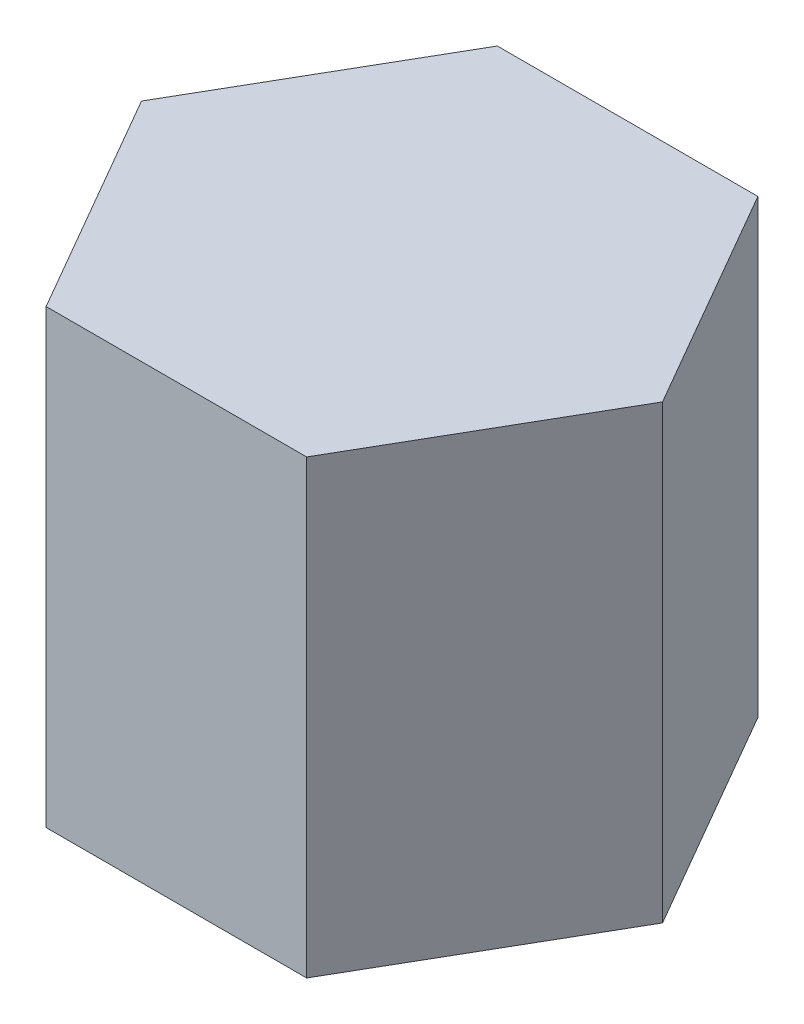
ISO-10303-21;
HEADER;
FILE_DESCRIPTION(('STEP AP214'),'2;1');
FILE_NAME('part.step','',(''),(''),'','','');
FILE_SCHEMA(('AUTOMOTIVE_DESIGN { 1 0 10303 214 1 1 1 1 }'));
ENDSEC;
DATA;
#1=APPLICATION_CONTEXT('core data for automotive mechanical design processes');
#2=APPLICATION_PROTOCOL_DEFINITION('international standard','automotive_design',2000,#1);
#3=PRODUCT_CONTEXT('',#1,'mechanical');
#4=PRODUCT('Part','Part','',(#3));
#5=PRODUCT_RELATED_PRODUCT_CATEGORY('part','',(#4));
#6=PRODUCT_DEFINITION_FORMATION('','',#4);
#7=PRODUCT_DEFINITION_CONTEXT('part definition',#1,'design');
#8=PRODUCT_DEFINITION('design','',#6,#7);
#9=PRODUCT_DEFINITION_SHAPE('','',#8);
#10=(LENGTH_UNIT() NAMED_UNIT(*) SI_UNIT(.MILLI.,.METRE.));
#11=(NAMED_UNIT(*) PLANE_ANGLE_UNIT() SI_UNIT($,.RADIAN.));
#12=(NAMED_UNIT(*) SI_UNIT($,.STERADIAN.) SOLID_ANGLE_UNIT());
#13=UNCERTAINTY_MEASURE_WITH_UNIT(LENGTH_MEASURE(1.E-05),#10,'distance_accuracy_value','');
#14=(GEOMETRIC_REPRESENTATION_CONTEXT(3) GLOBAL_UNCERTAINTY_ASSIGNED_CONTEXT((#13)) GLOBAL_UNIT_ASSIGNED_CONTEXT((#10,
#11,#12)) REPRESENTATION_CONTEXT('',''));
#15=CARTESIAN_POINT('',(0.,0.,0.));
#16=DIRECTION('',(0.,0.,1.));
#17=DIRECTION('',(1.,0.,0.));
#18=AXIS2_PLACEMENT_3D('',#15,#16,#17);
#19=CARTESIAN_POINT('',(28.8675134594813,100.,-50.));
#20=DIRECTION('',(0.,0.,1.));
#21=DIRECTION('',(1.,0.,0.));
#22=AXIS2_PLACEMENT_3D('',#19,#20,#21);
#23=PLANE('',#22);
#24=DIRECTION('',(-1.,0.,0.));
#25=VECTOR('',#24,1.);
#26=CARTESIAN_POINT('',(28.8675134594813,0.,-50.));
#27=LINE('',#26,#25);
#28=CARTESIAN_POINT('',(28.8675134594813,0.,-50.));
#29=VERTEX_POINT('',#28);
#30=CARTESIAN_POINT('',(-28.8675134594813,0.,-50.));
#31=VERTEX_POINT('',#30);
#32=EDGE_CURVE('E125',#29,#31,#27,.T.);
#33=ORIENTED_EDGE('',*,*,#32,.T.);
#34=DIRECTION('',(0.,-1.,0.));
#35=VECTOR('',#34,1.);
#36=CARTESIAN_POINT('',(-28.8675134594813,100.,-50.));
#37=LINE('',#36,#35);
#38=CARTESIAN_POINT('',(-28.8675134594813,100.,-50.));
#39=VERTEX_POINT('',#38);
#40=EDGE_CURVE('E11',#39,#31,#37,.T.);
#41=ORIENTED_EDGE('',*,*,#40,.F.);
#42=DIRECTION('',(-1.,0.,0.));
#43=VECTOR('',#42,1.);
#44=CARTESIAN_POINT('',(28.8675134594813,100.,-50.));
#45=LINE('',#44,#43);
#46=CARTESIAN_POINT('',(28.8675134594813,100.,-50.));
#47=VERTEX_POINT('',#46);
#48=EDGE_CURVE('E135',#47,#39,#45,.T.);
#49=ORIENTED_EDGE('',*,*,#48,.F.);
#50=DIRECTION('',(0.,-1.,0.));
#51=VECTOR('',#50,1.);
#52=CARTESIAN_POINT('',(28.8675134594813,100.,-50.));
#53=LINE('',#52,#51);
#54=EDGE_CURVE('E121',#47,#29,#53,.T.);
#55=ORIENTED_EDGE('',*,*,#54,.T.);
#56=EDGE_LOOP('',(#33,#41,#49,#55));
#57=FACE_BOUND('',#56,.T.);
#58=ADVANCED_FACE('F41',(#57),#23,.F.);
#59=CARTESIAN_POINT('',(-28.8675134594813,100.,-50.));
#60=DIRECTION('',(0.866025403784439,0.,0.5));
#61=DIRECTION('',(0.5,0.,-0.866025403784439));
#62=AXIS2_PLACEMENT_3D('',#59,#60,#61);
#63=PLANE('',#62);
#64=DIRECTION('',(-0.5,0.,0.866025403784439));
#65=VECTOR('',#64,1.);
#66=CARTESIAN_POINT('',(-28.8675134594813,0.,-50.));
#67=LINE('',#66,#65);
#68=CARTESIAN_POINT('',(-57.7350269189626,0.,0.));
#69=VERTEX_POINT('',#68);
#70=EDGE_CURVE('E128',#31,#69,#67,.T.);
#71=ORIENTED_EDGE('',*,*,#70,.T.);
#72=DIRECTION('',(0.,-1.,0.));
#73=VECTOR('',#72,1.);
#74=CARTESIAN_POINT('',(-57.7350269189626,100.,0.));
#75=LINE('',#74,#73);
#76=CARTESIAN_POINT('',(-57.7350269189626,100.,0.));
#77=VERTEX_POINT('',#76);
#78=EDGE_CURVE('E49',#77,#69,#75,.T.);
#79=ORIENTED_EDGE('',*,*,#78,.F.);
#80=DIRECTION('',(-0.5,0.,0.866025403784439));
#81=VECTOR('',#80,1.);
#82=CARTESIAN_POINT('',(-28.8675134594813,100.,-50.));
#83=LINE('',#82,#81);
#84=EDGE_CURVE('E94',#39,#77,#83,.T.);
#85=ORIENTED_EDGE('',*,*,#84,.F.);
#86=ORIENTED_EDGE('',*,*,#40,.T.);
#87=EDGE_LOOP('',(#71,#79,#85,#86));
#88=FACE_BOUND('',#87,.T.);
#89=ADVANCED_FACE('F159',(#88),#63,.F.);
#90=CARTESIAN_POINT('',(-57.7350269189626,100.,0.));
#91=DIRECTION('',(0.866025403784439,0.,-0.5));
#92=DIRECTION('',(-0.5,0.,-0.866025403784439));
#93=AXIS2_PLACEMENT_3D('',#90,#91,#92);
#94=PLANE('',#93);
#95=DIRECTION('',(0.5,0.,0.866025403784439));
#96=VECTOR('',#95,1.);
#97=CARTESIAN_POINT('',(-57.7350269189626,0.,0.));
#98=LINE('',#97,#96);
#99=CARTESIAN_POINT('',(-28.8675134594813,0.,50.));
#100=VERTEX_POINT('',#99);
#101=EDGE_CURVE('E130',#69,#100,#98,.T.);
#102=ORIENTED_EDGE('',*,*,#101,.T.);
#103=DIRECTION('',(0.,-1.,0.));
#104=VECTOR('',#103,1.);
#105=CARTESIAN_POINT('',(-28.8675134594813,100.,50.));
#106=LINE('',#105,#104);
#107=CARTESIAN_POINT('',(-28.8675134594813,100.,50.));
#108=VERTEX_POINT('',#107);
#109=EDGE_CURVE('E116',#108,#100,#106,.T.);
#110=ORIENTED_EDGE('',*,*,#109,.F.);
#111=DIRECTION('',(0.5,0.,0.866025403784439));
#112=VECTOR('',#111,1.);
#113=CARTESIAN_POINT('',(-57.7350269189626,100.,0.));
#114=LINE('',#113,#112);
#115=EDGE_CURVE('E107',#77,#108,#114,.T.);
#116=ORIENTED_EDGE('',*,*,#115,.F.);
#117=ORIENTED_EDGE('',*,*,#78,.T.);
#118=EDGE_LOOP('',(#102,#110,#116,#117));
#119=FACE_BOUND('',#118,.T.);
#120=ADVANCED_FACE('F141',(#119),#94,.F.);
#121=CARTESIAN_POINT('',(-28.8675134594813,100.,50.));
#122=DIRECTION('',(0.,0.,-1.));
#123=DIRECTION('',(-1.,0.,0.));
#124=AXIS2_PLACEMENT_3D('',#121,#122,#123);
#125=PLANE('',#124);
#126=DIRECTION('',(1.,0.,0.));
#127=VECTOR('',#126,1.);
#128=CARTESIAN_POINT('',(-28.8675134594813,0.,50.));
#129=LINE('',#128,#127);
#130=CARTESIAN_POINT('',(28.8675134594813,0.,50.));
#131=VERTEX_POINT('',#130);
#132=EDGE_CURVE('E115',#100,#131,#129,.T.);
#133=ORIENTED_EDGE('',*,*,#132,.T.);
#134=DIRECTION('',(0.,-1.,0.));
#135=VECTOR('',#134,1.);
#136=CARTESIAN_POINT('',(28.8675134594813,100.,50.));
#137=LINE('',#136,#135);
#138=CARTESIAN_POINT('',(28.8675134594813,100.,50.));
#139=VERTEX_POINT('',#138);
#140=EDGE_CURVE('E112',#139,#131,#137,.T.);
#141=ORIENTED_EDGE('',*,*,#140,.F.);
#142=DIRECTION('',(1.,0.,0.));
#143=VECTOR('',#142,1.);
#144=CARTESIAN_POINT('',(-28.8675134594813,100.,50.));
#145=LINE('',#144,#143);
#146=EDGE_CURVE('E101',#108,#139,#145,.T.);
#147=ORIENTED_EDGE('',*,*,#146,.F.);
#148=ORIENTED_EDGE('',*,*,#109,.T.);
#149=EDGE_LOOP('',(#133,#141,#147,#148));
#150=FACE_BOUND('',#149,.T.);
#151=ADVANCED_FACE('F113',(#150),#125,.F.);
#152=CARTESIAN_POINT('',(28.8675134594813,100.,50.));
#153=DIRECTION('',(-0.866025403784439,0.,-0.5));
#154=DIRECTION('',(-0.5,0.,0.866025403784439));
#155=AXIS2_PLACEMENT_3D('',#152,#153,#154);
#156=PLANE('',#155);
#157=DIRECTION('',(0.5,0.,-0.866025403784439));
#158=VECTOR('',#157,1.);
#159=CARTESIAN_POINT('',(28.8675134594813,0.,50.));
#160=LINE('',#159,#158);
#161=CARTESIAN_POINT('',(57.7350269189626,0.,0.));
#162=VERTEX_POINT('',#161);
#163=EDGE_CURVE('E80',#131,#162,#160,.T.);
#164=ORIENTED_EDGE('',*,*,#163,.T.);
#165=DIRECTION('',(0.,-1.,0.));
#166=VECTOR('',#165,1.);
#167=CARTESIAN_POINT('',(57.7350269189626,100.,0.));
#168=LINE('',#167,#166);
#169=CARTESIAN_POINT('',(57.7350269189626,100.,0.));
#170=VERTEX_POINT('',#169);
#171=EDGE_CURVE('E117',#170,#162,#168,.T.);
#172=ORIENTED_EDGE('',*,*,#171,.F.);
#173=DIRECTION('',(0.5,0.,-0.866025403784439));
#174=VECTOR('',#173,1.);
#175=CARTESIAN_POINT('',(28.8675134594813,100.,50.));
#176=LINE('',#175,#174);
#177=EDGE_CURVE('E105',#139,#170,#176,.T.);
#178=ORIENTED_EDGE('',*,*,#177,.F.);
#179=ORIENTED_EDGE('',*,*,#140,.T.);
#180=EDGE_LOOP('',(#164,#172,#178,#179));
#181=FACE_BOUND('',#180,.T.);
#182=ADVANCED_FACE('F119',(#181),#156,.F.);
#183=CARTESIAN_POINT('',(57.7350269189626,100.,0.));
#184=DIRECTION('',(-0.866025403784439,0.,0.5));
#185=DIRECTION('',(0.5,0.,0.866025403784439));
#186=AXIS2_PLACEMENT_3D('',#183,#184,#185);
#187=PLANE('',#186);
#188=DIRECTION('',(-0.5,0.,-0.866025403784439));
#189=VECTOR('',#188,1.);
#190=CARTESIAN_POINT('',(57.7350269189626,0.,0.));
#191=LINE('',#190,#189);
#192=EDGE_CURVE('E86',#162,#29,#191,.T.);
#193=ORIENTED_EDGE('',*,*,#192,.T.);
#194=ORIENTED_EDGE('',*,*,#54,.F.);
#195=DIRECTION('',(-0.5,0.,-0.866025403784439));
#196=VECTOR('',#195,1.);
#197=CARTESIAN_POINT('',(57.7350269189626,100.,0.));
#198=LINE('',#197,#196);
#199=EDGE_CURVE('E57',#170,#47,#198,.T.);
#200=ORIENTED_EDGE('',*,*,#199,.F.);
#201=ORIENTED_EDGE('',*,*,#171,.T.);
#202=EDGE_LOOP('',(#193,#194,#200,#201));
#203=FACE_BOUND('',#202,.T.);
#204=ADVANCED_FACE('F148',(#203),#187,.F.);
#205=CARTESIAN_POINT('',(0.,100.,0.));
#206=DIRECTION('',(0.,1.,0.));
#207=DIRECTION('',(0.,0.,1.));
#208=AXIS2_PLACEMENT_3D('',#205,#206,#207);
#209=PLANE('',#208);
#210=ORIENTED_EDGE('',*,*,#48,.T.);
#211=ORIENTED_EDGE('',*,*,#84,.T.);
#212=ORIENTED_EDGE('',*,*,#115,.T.);
#213=ORIENTED_EDGE('',*,*,#146,.T.);
#214=ORIENTED_EDGE('',*,*,#177,.T.);
#215=ORIENTED_EDGE('',*,*,#199,.T.);
#216=EDGE_LOOP('',(#210,#211,#212,#213,#214,#215));
#217=FACE_BOUND('',#216,.T.);
#218=ADVANCED_FACE('F103',(#217),#209,.T.);
#219=CARTESIAN_POINT('',(0.,0.,0.));
#220=DIRECTION('',(0.,1.,0.));
#221=DIRECTION('',(0.,0.,1.));
#222=AXIS2_PLACEMENT_3D('',#219,#220,#221);
#223=PLANE('',#222);
#224=ORIENTED_EDGE('',*,*,#32,.F.);
#225=ORIENTED_EDGE('',*,*,#192,.F.);
#226=ORIENTED_EDGE('',*,*,#163,.F.);
#227=ORIENTED_EDGE('',*,*,#132,.F.);
#228=ORIENTED_EDGE('',*,*,#101,.F.);
#229=ORIENTED_EDGE('',*,*,#70,.F.);
#230=EDGE_LOOP('',(#224,#225,#226,#227,#228,#229));
#231=FACE_BOUND('',#230,.T.);
#232=ADVANCED_FACE('F144',(#231),#223,.F.);
#233=CLOSED_SHELL('',(#58,#89,#120,#151,#182,#204,#218,#232));
#234=MANIFOLD_SOLID_BREP('B2',#233);
#235=ADVANCED_BREP_SHAPE_REPRESENTATION('',(#18,#234),#14);
#236=SHAPE_DEFINITION_REPRESENTATION(#9,#235);
ENDSEC;
END-ISO-10303-21;
